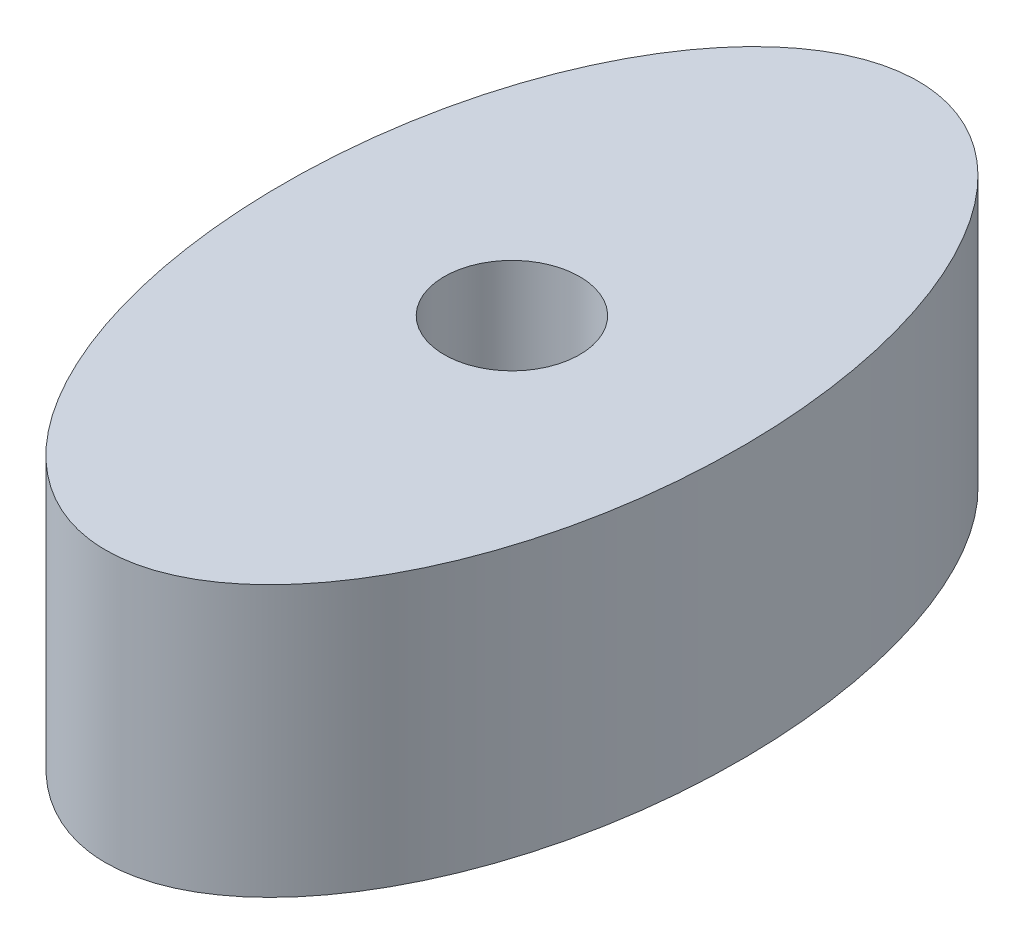
ISO-10303-21;
HEADER;
FILE_DESCRIPTION(('STEP AP214'),'2;1');
FILE_NAME('part.step','',(''),(''),'','','');
FILE_SCHEMA(('AUTOMOTIVE_DESIGN { 1 0 10303 214 1 1 1 1 }'));
ENDSEC;
DATA;
#1=APPLICATION_CONTEXT('core data for automotive mechanical design processes');
#2=APPLICATION_PROTOCOL_DEFINITION('international standard','automotive_design',2000,#1);
#3=PRODUCT_CONTEXT('',#1,'mechanical');
#4=PRODUCT('Part','Part','',(#3));
#5=PRODUCT_RELATED_PRODUCT_CATEGORY('part','',(#4));
#6=PRODUCT_DEFINITION_FORMATION('','',#4);
#7=PRODUCT_DEFINITION_CONTEXT('part definition',#1,'design');
#8=PRODUCT_DEFINITION('design','',#6,#7);
#9=PRODUCT_DEFINITION_SHAPE('','',#8);
#10=(LENGTH_UNIT() NAMED_UNIT(*) SI_UNIT(.MILLI.,.METRE.));
#11=(NAMED_UNIT(*) PLANE_ANGLE_UNIT() SI_UNIT($,.RADIAN.));
#12=(NAMED_UNIT(*) SI_UNIT($,.STERADIAN.) SOLID_ANGLE_UNIT());
#13=UNCERTAINTY_MEASURE_WITH_UNIT(LENGTH_MEASURE(1.E-05),#10,'distance_accuracy_value','');
#14=(GEOMETRIC_REPRESENTATION_CONTEXT(3) GLOBAL_UNCERTAINTY_ASSIGNED_CONTEXT((#13)) GLOBAL_UNIT_ASSIGNED_CONTEXT((#10,
#11,#12)) REPRESENTATION_CONTEXT('',''));
#15=CARTESIAN_POINT('',(0.,0.,0.));
#16=DIRECTION('',(0.,0.,1.));
#17=DIRECTION('',(1.,0.,0.));
#18=AXIS2_PLACEMENT_3D('',#15,#16,#17);
#19=CARTESIAN_POINT('',(0.,16.,0.));
#20=DIRECTION('',(0.,1.,0.));
#21=DIRECTION('',(0.,0.,1.));
#22=AXIS2_PLACEMENT_3D('',#19,#20,#21);
#23=ELLIPSE('',#22,24.,13.5);
#24=DIRECTION('',(0.,-1.,0.));
#25=VECTOR('',#24,1.);
#26=SURFACE_OF_LINEAR_EXTRUSION('',#23,#25);
#27=CARTESIAN_POINT('',(0.,16.,24.));
#28=VERTEX_POINT('',#27);
#29=EDGE_CURVE('E10',#28,#28,#23,.T.);
#30=ORIENTED_EDGE('',*,*,#29,.F.);
#31=EDGE_LOOP('',(#30));
#32=FACE_BOUND('',#31,.T.);
#33=CARTESIAN_POINT('',(0.,0.,0.));
#34=DIRECTION('',(0.,1.,0.));
#35=DIRECTION('',(0.,0.,1.));
#36=AXIS2_PLACEMENT_3D('',#33,#34,#35);
#37=ELLIPSE('',#36,24.,13.5);
#38=CARTESIAN_POINT('',(0.,0.,24.));
#39=VERTEX_POINT('',#38);
#40=EDGE_CURVE('E36',#39,#39,#37,.T.);
#41=ORIENTED_EDGE('',*,*,#40,.T.);
#42=EDGE_LOOP('',(#41));
#43=FACE_BOUND('',#42,.T.);
#44=ADVANCED_FACE('F32',(#32,#43),#26,.F.);
#45=CARTESIAN_POINT('',(0.,16.,0.));
#46=DIRECTION('',(0.,1.,0.));
#47=DIRECTION('',(0.,0.,1.));
#48=AXIS2_PLACEMENT_3D('',#45,#46,#47);
#49=PLANE('',#48);
#50=CARTESIAN_POINT('',(0.,16.,0.));
#51=DIRECTION('',(0.,-1.,0.));
#52=DIRECTION('',(0.,0.,-1.));
#53=AXIS2_PLACEMENT_3D('',#50,#51,#52);
#54=CIRCLE('',#53,4.);
#55=CARTESIAN_POINT('',(0.,16.,-4.));
#56=VERTEX_POINT('',#55);
#57=EDGE_CURVE('E42',#56,#56,#54,.T.);
#58=ORIENTED_EDGE('',*,*,#57,.T.);
#59=EDGE_LOOP('',(#58));
#60=FACE_BOUND('',#59,.T.);
#61=ORIENTED_EDGE('',*,*,#29,.T.);
#62=EDGE_LOOP('',(#61));
#63=FACE_BOUND('',#62,.T.);
#64=ADVANCED_FACE('F51',(#60,#63),#49,.T.);
#65=CARTESIAN_POINT('',(0.,0.,0.));
#66=DIRECTION('',(0.,1.,0.));
#67=DIRECTION('',(0.,0.,1.));
#68=AXIS2_PLACEMENT_3D('',#65,#66,#67);
#69=PLANE('',#68);
#70=CARTESIAN_POINT('',(0.,0.,0.));
#71=DIRECTION('',(0.,-1.,0.));
#72=DIRECTION('',(0.,0.,-1.));
#73=AXIS2_PLACEMENT_3D('',#70,#71,#72);
#74=CIRCLE('',#73,4.);
#75=CARTESIAN_POINT('',(0.,0.,-4.));
#76=VERTEX_POINT('',#75);
#77=EDGE_CURVE('E45',#76,#76,#74,.T.);
#78=ORIENTED_EDGE('',*,*,#77,.F.);
#79=EDGE_LOOP('',(#78));
#80=FACE_BOUND('',#79,.T.);
#81=ORIENTED_EDGE('',*,*,#40,.F.);
#82=EDGE_LOOP('',(#81));
#83=FACE_BOUND('',#82,.T.);
#84=ADVANCED_FACE('F56',(#80,#83),#69,.F.);
#85=CARTESIAN_POINT('',(0.,16.,0.));
#86=DIRECTION('',(0.,-1.,0.));
#87=DIRECTION('',(0.,0.,-1.));
#88=AXIS2_PLACEMENT_3D('',#85,#86,#87);
#89=CYLINDRICAL_SURFACE('',#88,4.);
#90=ORIENTED_EDGE('',*,*,#57,.F.);
#91=EDGE_LOOP('',(#90));
#92=FACE_BOUND('',#91,.T.);
#93=ORIENTED_EDGE('',*,*,#77,.T.);
#94=EDGE_LOOP('',(#93));
#95=FACE_BOUND('',#94,.T.);
#96=ADVANCED_FACE('F53',(#92,#95),#89,.F.);
#97=CLOSED_SHELL('',(#44,#64,#84,#96));
#98=MANIFOLD_SOLID_BREP('B2',#97);
#99=ADVANCED_BREP_SHAPE_REPRESENTATION('',(#18,#98),#14);
#100=SHAPE_DEFINITION_REPRESENTATION(#9,#99);
ENDSEC;
END-ISO-10303-21;
